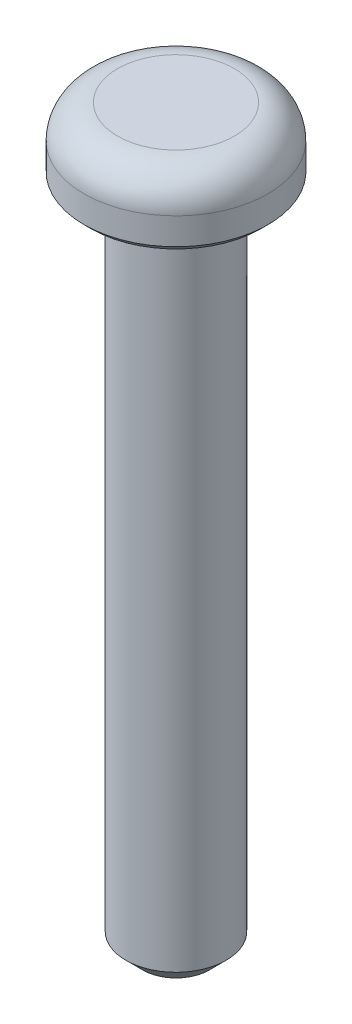
ISO-10303-21;
HEADER;
FILE_DESCRIPTION(('STEP AP214'),'2;1');
FILE_NAME('part.step','',(''),(''),'','','');
FILE_SCHEMA(('AUTOMOTIVE_DESIGN { 1 0 10303 214 1 1 1 1 }'));
ENDSEC;
DATA;
#1=APPLICATION_CONTEXT('core data for automotive mechanical design processes');
#2=APPLICATION_PROTOCOL_DEFINITION('international standard','automotive_design',2000,#1);
#3=PRODUCT_CONTEXT('',#1,'mechanical');
#4=PRODUCT('Part','Part','',(#3));
#5=PRODUCT_RELATED_PRODUCT_CATEGORY('part','',(#4));
#6=PRODUCT_DEFINITION_FORMATION('','',#4);
#7=PRODUCT_DEFINITION_CONTEXT('part definition',#1,'design');
#8=PRODUCT_DEFINITION('design','',#6,#7);
#9=PRODUCT_DEFINITION_SHAPE('','',#8);
#10=(LENGTH_UNIT() NAMED_UNIT(*) SI_UNIT(.MILLI.,.METRE.));
#11=(NAMED_UNIT(*) PLANE_ANGLE_UNIT() SI_UNIT($,.RADIAN.));
#12=(NAMED_UNIT(*) SI_UNIT($,.STERADIAN.) SOLID_ANGLE_UNIT());
#13=UNCERTAINTY_MEASURE_WITH_UNIT(LENGTH_MEASURE(1.E-05),#10,'distance_accuracy_value','');
#14=(GEOMETRIC_REPRESENTATION_CONTEXT(3) GLOBAL_UNCERTAINTY_ASSIGNED_CONTEXT((#13)) GLOBAL_UNIT_ASSIGNED_CONTEXT((#10,
#11,#12)) REPRESENTATION_CONTEXT('',''));
#15=CARTESIAN_POINT('',(0.,0.,0.));
#16=DIRECTION('',(0.,0.,1.));
#17=DIRECTION('',(1.,0.,0.));
#18=AXIS2_PLACEMENT_3D('',#15,#16,#17);
#19=CARTESIAN_POINT('',(1.5,0.,0.));
#20=DIRECTION('',(0.,-1.,0.));
#21=DIRECTION('',(0.,0.,-1.));
#22=AXIS2_PLACEMENT_3D('',#19,#20,#21);
#23=PLANE('',#22);
#24=CARTESIAN_POINT('',(0.,0.,0.));
#25=DIRECTION('',(0.,-1.,0.));
#26=DIRECTION('',(0.,0.,-1.));
#27=AXIS2_PLACEMENT_3D('',#24,#25,#26);
#28=CIRCLE('',#27,0.999999999999997);
#29=CARTESIAN_POINT('',(0.,0.,-0.999999999999997));
#30=VERTEX_POINT('',#29);
#31=EDGE_CURVE('E45',#30,#30,#28,.T.);
#32=ORIENTED_EDGE('',*,*,#31,.T.);
#33=EDGE_LOOP('',(#32));
#34=FACE_BOUND('',#33,.T.);
#35=ADVANCED_FACE('F30',(#34),#23,.T.);
#36=CARTESIAN_POINT('',(0.,22.,0.));
#37=DIRECTION('',(0.,1.,0.));
#38=DIRECTION('',(0.,0.,1.));
#39=AXIS2_PLACEMENT_3D('',#36,#37,#38);
#40=PLANE('',#39);
#41=CARTESIAN_POINT('',(0.,22.,0.));
#42=DIRECTION('',(0.,1.,0.));
#43=DIRECTION('',(0.,0.,1.));
#44=AXIS2_PLACEMENT_3D('',#41,#42,#43);
#45=CIRCLE('',#44,1.75);
#46=CARTESIAN_POINT('',(0.,22.,1.75));
#47=VERTEX_POINT('',#46);
#48=EDGE_CURVE('E50',#47,#47,#45,.T.);
#49=ORIENTED_EDGE('',*,*,#48,.T.);
#50=EDGE_LOOP('',(#49));
#51=FACE_BOUND('',#50,.T.);
#52=ADVANCED_FACE('F73',(#51),#40,.T.);
#53=CARTESIAN_POINT('',(0.,0.,0.));
#54=DIRECTION('',(0.,-1.,0.));
#55=DIRECTION('',(0.,0.,-1.));
#56=AXIS2_PLACEMENT_3D('',#53,#54,#55);
#57=CYLINDRICAL_SURFACE('',#56,2.75);
#58=CARTESIAN_POINT('',(0.,20.2,0.));
#59=DIRECTION('',(0.,-1.,0.));
#60=DIRECTION('',(0.,0.,-1.));
#61=AXIS2_PLACEMENT_3D('',#58,#59,#60);
#62=CIRCLE('',#61,2.75);
#63=CARTESIAN_POINT('',(0.,20.2,-2.75));
#64=VERTEX_POINT('',#63);
#65=EDGE_CURVE('E10',#64,#64,#62,.F.);
#66=ORIENTED_EDGE('',*,*,#65,.T.);
#67=EDGE_LOOP('',(#66));
#68=FACE_BOUND('',#67,.T.);
#69=CARTESIAN_POINT('',(0.,21.,0.));
#70=DIRECTION('',(0.,1.,0.));
#71=DIRECTION('',(0.,0.,1.));
#72=AXIS2_PLACEMENT_3D('',#69,#70,#71);
#73=CIRCLE('',#72,2.75);
#74=CARTESIAN_POINT('',(0.,21.,2.75));
#75=VERTEX_POINT('',#74);
#76=EDGE_CURVE('E53',#75,#75,#73,.F.);
#77=ORIENTED_EDGE('',*,*,#76,.T.);
#78=EDGE_LOOP('',(#77));
#79=FACE_BOUND('',#78,.T.);
#80=ADVANCED_FACE('F64',(#68,#79),#57,.T.);
#81=CARTESIAN_POINT('',(2.75,20.,0.));
#82=DIRECTION('',(0.,-1.,0.));
#83=DIRECTION('',(0.,0.,-1.));
#84=AXIS2_PLACEMENT_3D('',#81,#82,#83);
#85=PLANE('',#84);
#86=CARTESIAN_POINT('',(0.,20.,0.));
#87=DIRECTION('',(0.,-1.,0.));
#88=DIRECTION('',(0.,0.,-1.));
#89=AXIS2_PLACEMENT_3D('',#86,#87,#88);
#90=CIRCLE('',#89,2.55);
#91=CARTESIAN_POINT('',(0.,20.,-2.55));
#92=VERTEX_POINT('',#91);
#93=EDGE_CURVE('E37',#92,#92,#90,.T.);
#94=ORIENTED_EDGE('',*,*,#93,.T.);
#95=EDGE_LOOP('',(#94));
#96=FACE_BOUND('',#95,.T.);
#97=CARTESIAN_POINT('',(0.,20.,0.));
#98=DIRECTION('',(0.,-1.,0.));
#99=DIRECTION('',(0.,0.,-1.));
#100=AXIS2_PLACEMENT_3D('',#97,#98,#99);
#101=CIRCLE('',#100,1.5);
#102=CARTESIAN_POINT('',(0.,20.,-1.5));
#103=VERTEX_POINT('',#102);
#104=EDGE_CURVE('E56',#103,#103,#101,.T.);
#105=ORIENTED_EDGE('',*,*,#104,.F.);
#106=EDGE_LOOP('',(#105));
#107=FACE_BOUND('',#106,.T.);
#108=ADVANCED_FACE('F62',(#96,#107),#85,.T.);
#109=CARTESIAN_POINT('',(0.,0.,0.));
#110=DIRECTION('',(0.,-1.,0.));
#111=DIRECTION('',(0.,0.,-1.));
#112=AXIS2_PLACEMENT_3D('',#109,#110,#111);
#113=CYLINDRICAL_SURFACE('',#112,1.5);
#114=CARTESIAN_POINT('',(0.,0.500000000000003,0.));
#115=DIRECTION('',(0.,-1.,0.));
#116=DIRECTION('',(0.,0.,-1.));
#117=AXIS2_PLACEMENT_3D('',#114,#115,#116);
#118=CIRCLE('',#117,1.5);
#119=CARTESIAN_POINT('',(0.,0.500000000000003,-1.5));
#120=VERTEX_POINT('',#119);
#121=EDGE_CURVE('E41',#120,#120,#118,.F.);
#122=ORIENTED_EDGE('',*,*,#121,.T.);
#123=EDGE_LOOP('',(#122));
#124=FACE_BOUND('',#123,.T.);
#125=ORIENTED_EDGE('',*,*,#104,.T.);
#126=EDGE_LOOP('',(#125));
#127=FACE_BOUND('',#126,.T.);
#128=ADVANCED_FACE('F60',(#124,#127),#113,.T.);
#129=CARTESIAN_POINT('',(0.,21.,0.));
#130=DIRECTION('',(0.,1.,0.));
#131=DIRECTION('',(0.,0.,1.));
#132=AXIS2_PLACEMENT_3D('',#129,#130,#131);
#133=TOROIDAL_SURFACE('',#132,1.75,1.);
#134=ORIENTED_EDGE('',*,*,#48,.F.);
#135=EDGE_LOOP('',(#134));
#136=FACE_BOUND('',#135,.T.);
#137=ORIENTED_EDGE('',*,*,#76,.F.);
#138=EDGE_LOOP('',(#137));
#139=FACE_BOUND('',#138,.T.);
#140=ADVANCED_FACE('F70',(#136,#139),#133,.T.);
#141=CARTESIAN_POINT('',(0.,0.,0.));
#142=DIRECTION('',(0.,1.,0.));
#143=DIRECTION('',(0.,0.,1.));
#144=AXIS2_PLACEMENT_3D('',#141,#142,#143);
#145=CONICAL_SURFACE('',#144,0.999999999999997,0.785398163397447);
#146=ORIENTED_EDGE('',*,*,#121,.F.);
#147=EDGE_LOOP('',(#146));
#148=FACE_BOUND('',#147,.T.);
#149=ORIENTED_EDGE('',*,*,#31,.F.);
#150=EDGE_LOOP('',(#149));
#151=FACE_BOUND('',#150,.T.);
#152=ADVANCED_FACE('F85',(#148,#151),#145,.T.);
#153=CARTESIAN_POINT('',(0.,20.,0.));
#154=DIRECTION('',(0.,1.,0.));
#155=DIRECTION('',(0.,0.,1.));
#156=AXIS2_PLACEMENT_3D('',#153,#154,#155);
#157=CONICAL_SURFACE('',#156,2.55,0.785398163397442);
#158=ORIENTED_EDGE('',*,*,#65,.F.);
#159=EDGE_LOOP('',(#158));
#160=FACE_BOUND('',#159,.T.);
#161=ORIENTED_EDGE('',*,*,#93,.F.);
#162=EDGE_LOOP('',(#161));
#163=FACE_BOUND('',#162,.T.);
#164=ADVANCED_FACE('F32',(#160,#163),#157,.T.);
#165=CLOSED_SHELL('',(#35,#52,#80,#108,#128,#140,#152,#164));
#166=MANIFOLD_SOLID_BREP('B2',#165);
#167=ADVANCED_BREP_SHAPE_REPRESENTATION('',(#18,#166),#14);
#168=SHAPE_DEFINITION_REPRESENTATION(#9,#167);
ENDSEC;
END-ISO-10303-21;
